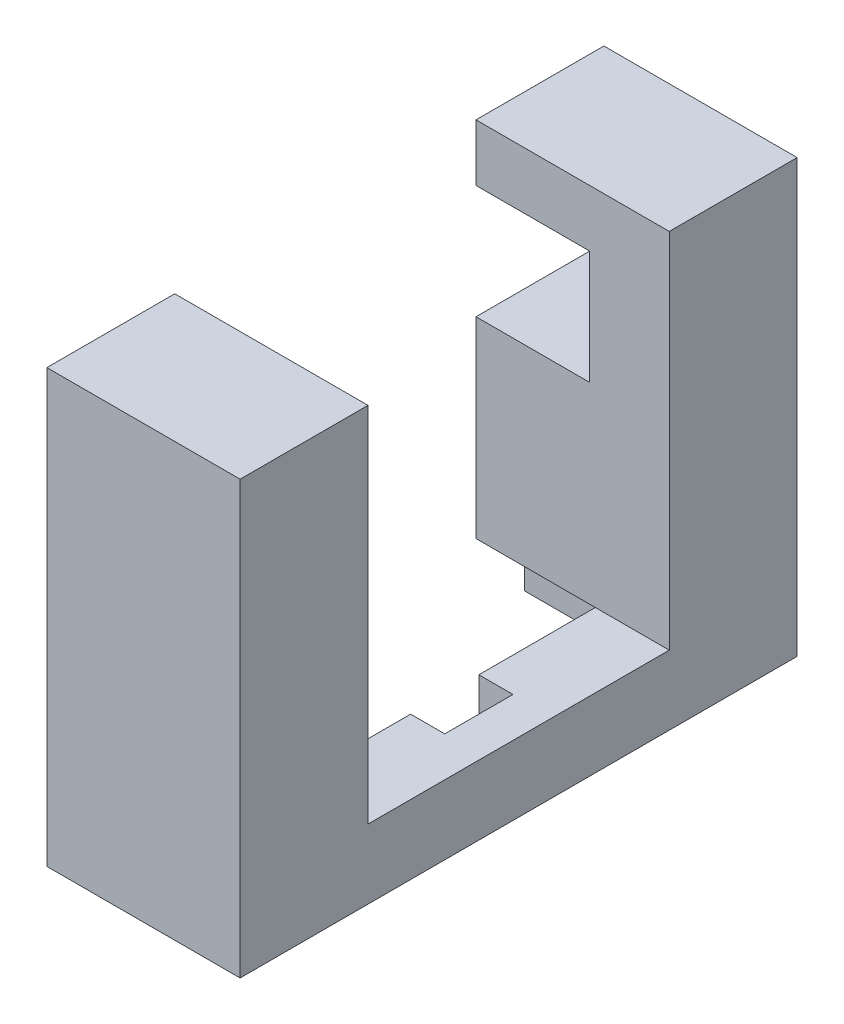
ISO-10303-21;
HEADER;
FILE_DESCRIPTION(('STEP AP214'),'2;1');
FILE_NAME('part.step','',(''),(''),'','','');
FILE_SCHEMA(('AUTOMOTIVE_DESIGN { 1 0 10303 214 1 1 1 1 }'));
ENDSEC;
DATA;
#1=APPLICATION_CONTEXT('core data for automotive mechanical design processes');
#2=APPLICATION_PROTOCOL_DEFINITION('international standard','automotive_design',2000,#1);
#3=PRODUCT_CONTEXT('',#1,'mechanical');
#4=PRODUCT('Part','Part','',(#3));
#5=PRODUCT_RELATED_PRODUCT_CATEGORY('part','',(#4));
#6=PRODUCT_DEFINITION_FORMATION('','',#4);
#7=PRODUCT_DEFINITION_CONTEXT('part definition',#1,'design');
#8=PRODUCT_DEFINITION('design','',#6,#7);
#9=PRODUCT_DEFINITION_SHAPE('','',#8);
#10=(LENGTH_UNIT() NAMED_UNIT(*) SI_UNIT(.MILLI.,.METRE.));
#11=(NAMED_UNIT(*) PLANE_ANGLE_UNIT() SI_UNIT($,.RADIAN.));
#12=(NAMED_UNIT(*) SI_UNIT($,.STERADIAN.) SOLID_ANGLE_UNIT());
#13=UNCERTAINTY_MEASURE_WITH_UNIT(LENGTH_MEASURE(1.E-05),#10,'distance_accuracy_value','');
#14=(GEOMETRIC_REPRESENTATION_CONTEXT(3) GLOBAL_UNCERTAINTY_ASSIGNED_CONTEXT((#13)) GLOBAL_UNIT_ASSIGNED_CONTEXT((#10,
#11,#12)) REPRESENTATION_CONTEXT('',''));
#15=CARTESIAN_POINT('',(0.,0.,0.));
#16=DIRECTION('',(0.,0.,1.));
#17=DIRECTION('',(1.,0.,0.));
#18=AXIS2_PLACEMENT_3D('',#15,#16,#17);
#19=CARTESIAN_POINT('',(30.5,38.001,-3.));
#20=DIRECTION('',(0.,0.,-1.));
#21=DIRECTION('',(-1.,0.,0.));
#22=AXIS2_PLACEMENT_3D('',#19,#20,#21);
#23=PLANE('',#22);
#24=DIRECTION('',(0.,-1.,0.));
#25=VECTOR('',#24,1.);
#26=CARTESIAN_POINT('',(27.5,38.001,-3.));
#27=LINE('',#26,#25);
#28=CARTESIAN_POINT('',(27.5,6.09999999999999,-3.));
#29=VERTEX_POINT('',#28);
#30=CARTESIAN_POINT('',(27.5,0.,-3.));
#31=VERTEX_POINT('',#30);
#32=EDGE_CURVE('E707',#29,#31,#27,.T.);
#33=ORIENTED_EDGE('',*,*,#32,.T.);
#34=DIRECTION('',(1.,0.,0.));
#35=VECTOR('',#34,1.);
#36=CARTESIAN_POINT('',(30.5,0.,-3.));
#37=LINE('',#36,#35);
#38=CARTESIAN_POINT('',(30.5,0.,-3.));
#39=VERTEX_POINT('',#38);
#40=EDGE_CURVE('E219',#31,#39,#37,.T.);
#41=ORIENTED_EDGE('',*,*,#40,.T.);
#42=DIRECTION('',(0.,-1.,0.));
#43=VECTOR('',#42,1.);
#44=CARTESIAN_POINT('',(30.5,38.001,-3.));
#45=LINE('',#44,#43);
#46=CARTESIAN_POINT('',(30.5,6.1,-3.));
#47=VERTEX_POINT('',#46);
#48=EDGE_CURVE('E711',#47,#39,#45,.T.);
#49=ORIENTED_EDGE('',*,*,#48,.F.);
#50=DIRECTION('',(1.,0.,0.));
#51=VECTOR('',#50,1.);
#52=CARTESIAN_POINT('',(30.5,6.1,-3.));
#53=LINE('',#52,#51);
#54=EDGE_CURVE('E209',#29,#47,#53,.T.);
#55=ORIENTED_EDGE('',*,*,#54,.F.);
#56=EDGE_LOOP('',(#33,#41,#49,#55));
#57=FACE_BOUND('',#56,.T.);
#58=ADVANCED_FACE('F32',(#57),#23,.F.);
#59=CARTESIAN_POINT('',(30.5,38.001,-3.));
#60=DIRECTION('',(1.,0.,0.));
#61=DIRECTION('',(0.,0.,-1.));
#62=AXIS2_PLACEMENT_3D('',#59,#60,#61);
#63=PLANE('',#62);
#64=ORIENTED_EDGE('',*,*,#48,.T.);
#65=DIRECTION('',(0.,0.,1.));
#66=VECTOR('',#65,1.);
#67=CARTESIAN_POINT('',(30.5,0.,-3.));
#68=LINE('',#67,#66);
#69=CARTESIAN_POINT('',(30.5,0.,3.));
#70=VERTEX_POINT('',#69);
#71=EDGE_CURVE('E714',#39,#70,#68,.T.);
#72=ORIENTED_EDGE('',*,*,#71,.T.);
#73=DIRECTION('',(0.,-1.,0.));
#74=VECTOR('',#73,1.);
#75=CARTESIAN_POINT('',(30.5,38.001,3.));
#76=LINE('',#75,#74);
#77=CARTESIAN_POINT('',(30.5,6.1,3.));
#78=VERTEX_POINT('',#77);
#79=EDGE_CURVE('E210',#78,#70,#76,.T.);
#80=ORIENTED_EDGE('',*,*,#79,.F.);
#81=DIRECTION('',(0.,0.,1.));
#82=VECTOR('',#81,1.);
#83=CARTESIAN_POINT('',(30.5,6.1,-3.));
#84=LINE('',#83,#82);
#85=EDGE_CURVE('E218',#47,#78,#84,.T.);
#86=ORIENTED_EDGE('',*,*,#85,.F.);
#87=EDGE_LOOP('',(#64,#72,#80,#86));
#88=FACE_BOUND('',#87,.T.);
#89=ADVANCED_FACE('F419',(#88),#63,.F.);
#90=CARTESIAN_POINT('',(30.5,38.001,3.));
#91=DIRECTION('',(0.,0.,1.));
#92=DIRECTION('',(1.,0.,0.));
#93=AXIS2_PLACEMENT_3D('',#90,#91,#92);
#94=PLANE('',#93);
#95=ORIENTED_EDGE('',*,*,#79,.T.);
#96=DIRECTION('',(-1.,0.,0.));
#97=VECTOR('',#96,1.);
#98=CARTESIAN_POINT('',(30.5,0.,3.));
#99=LINE('',#98,#97);
#100=CARTESIAN_POINT('',(27.5,0.,3.));
#101=VERTEX_POINT('',#100);
#102=EDGE_CURVE('E205',#70,#101,#99,.T.);
#103=ORIENTED_EDGE('',*,*,#102,.T.);
#104=DIRECTION('',(0.,-1.,0.));
#105=VECTOR('',#104,1.);
#106=CARTESIAN_POINT('',(27.5,38.001,3.));
#107=LINE('',#106,#105);
#108=CARTESIAN_POINT('',(27.5,6.09999999999999,3.));
#109=VERTEX_POINT('',#108);
#110=EDGE_CURVE('E199',#109,#101,#107,.T.);
#111=ORIENTED_EDGE('',*,*,#110,.F.);
#112=DIRECTION('',(-1.,0.,0.));
#113=VECTOR('',#112,1.);
#114=CARTESIAN_POINT('',(30.5,6.1,3.));
#115=LINE('',#114,#113);
#116=EDGE_CURVE('E202',#78,#109,#115,.T.);
#117=ORIENTED_EDGE('',*,*,#116,.F.);
#118=EDGE_LOOP('',(#95,#103,#111,#117));
#119=FACE_BOUND('',#118,.T.);
#120=ADVANCED_FACE('F201',(#119),#94,.F.);
#121=CARTESIAN_POINT('',(34.,6.1,24.5));
#122=DIRECTION('',(0.,0.,-1.));
#123=DIRECTION('',(-1.,0.,0.));
#124=AXIS2_PLACEMENT_3D('',#121,#122,#123);
#125=PLANE('',#124);
#126=DIRECTION('',(0.,-1.,0.));
#127=VECTOR('',#126,1.);
#128=CARTESIAN_POINT('',(17.,38.,24.5));
#129=LINE('',#128,#127);
#130=CARTESIAN_POINT('',(17.,38.,24.5));
#131=VERTEX_POINT('',#130);
#132=CARTESIAN_POINT('',(17.,0.,24.5));
#133=VERTEX_POINT('',#132);
#134=EDGE_CURVE('E48',#131,#133,#129,.T.);
#135=ORIENTED_EDGE('',*,*,#134,.T.);
#136=DIRECTION('',(1.,0.,0.));
#137=VECTOR('',#136,1.);
#138=CARTESIAN_POINT('',(34.,0.,24.5));
#139=LINE('',#138,#137);
#140=CARTESIAN_POINT('',(34.,0.,24.5));
#141=VERTEX_POINT('',#140);
#142=EDGE_CURVE('E361',#133,#141,#139,.T.);
#143=ORIENTED_EDGE('',*,*,#142,.T.);
#144=DIRECTION('',(0.,-1.,0.));
#145=VECTOR('',#144,1.);
#146=CARTESIAN_POINT('',(34.,6.1,24.5));
#147=LINE('',#146,#145);
#148=CARTESIAN_POINT('',(34.,38.,24.5));
#149=VERTEX_POINT('',#148);
#150=EDGE_CURVE('E374',#149,#141,#147,.T.);
#151=ORIENTED_EDGE('',*,*,#150,.F.);
#152=DIRECTION('',(-1.,0.,0.));
#153=VECTOR('',#152,1.);
#154=CARTESIAN_POINT('',(34.,38.,24.5));
#155=LINE('',#154,#153);
#156=EDGE_CURVE('E340',#149,#131,#155,.T.);
#157=ORIENTED_EDGE('',*,*,#156,.T.);
#158=EDGE_LOOP('',(#135,#143,#151,#157));
#159=FACE_BOUND('',#158,.T.);
#160=ADVANCED_FACE('F34',(#159),#125,.F.);
#161=CARTESIAN_POINT('',(0.,6.1,0.));
#162=DIRECTION('',(0.,1.,0.));
#163=DIRECTION('',(0.,0.,1.));
#164=AXIS2_PLACEMENT_3D('',#161,#162,#163);
#165=PLANE('',#164);
#166=ORIENTED_EDGE('',*,*,#116,.T.);
#167=DIRECTION('',(0.,0.,1.));
#168=VECTOR('',#167,1.);
#169=CARTESIAN_POINT('',(27.5,6.09999999999999,-17.5));
#170=LINE('',#169,#168);
#171=CARTESIAN_POINT('',(27.5,6.09999999999999,13.25));
#172=VERTEX_POINT('',#171);
#173=EDGE_CURVE('E215',#109,#172,#170,.T.);
#174=ORIENTED_EDGE('',*,*,#173,.T.);
#175=DIRECTION('',(-1.,0.,0.));
#176=VECTOR('',#175,1.);
#177=CARTESIAN_POINT('',(0.,6.1,13.25));
#178=LINE('',#177,#176);
#179=CARTESIAN_POINT('',(34.,6.1,13.25));
#180=VERTEX_POINT('',#179);
#181=EDGE_CURVE('E359',#180,#172,#178,.T.);
#182=ORIENTED_EDGE('',*,*,#181,.F.);
#183=DIRECTION('',(0.,0.,-1.));
#184=VECTOR('',#183,1.);
#185=CARTESIAN_POINT('',(34.,6.1,24.5));
#186=LINE('',#185,#184);
#187=CARTESIAN_POINT('',(34.,6.1,-13.25));
#188=VERTEX_POINT('',#187);
#189=EDGE_CURVE('E362',#180,#188,#186,.T.);
#190=ORIENTED_EDGE('',*,*,#189,.T.);
#191=DIRECTION('',(1.,0.,0.));
#192=VECTOR('',#191,1.);
#193=CARTESIAN_POINT('',(0.,6.1,-13.25));
#194=LINE('',#193,#192);
#195=CARTESIAN_POINT('',(27.5,6.1,-13.25));
#196=VERTEX_POINT('',#195);
#197=EDGE_CURVE('E327',#196,#188,#194,.T.);
#198=ORIENTED_EDGE('',*,*,#197,.F.);
#199=EDGE_CURVE('E226',#196,#29,#170,.T.);
#200=ORIENTED_EDGE('',*,*,#199,.T.);
#201=ORIENTED_EDGE('',*,*,#54,.T.);
#202=ORIENTED_EDGE('',*,*,#85,.T.);
#203=EDGE_LOOP('',(#166,#174,#182,#190,#198,#200,#201,#202));
#204=FACE_BOUND('',#203,.T.);
#205=ADVANCED_FACE('F214',(#204),#165,.T.);
#206=CARTESIAN_POINT('',(-34.001,23.,23.25));
#207=DIRECTION('',(0.,-1.,0.));
#208=DIRECTION('',(0.,0.,-1.));
#209=AXIS2_PLACEMENT_3D('',#206,#207,#208);
#210=PLANE('',#209);
#211=DIRECTION('',(-1.,0.,0.));
#212=VECTOR('',#211,1.);
#213=CARTESIAN_POINT('',(-34.001,23.,-13.25));
#214=LINE('',#213,#212);
#215=CARTESIAN_POINT('',(27.,23.,-13.25));
#216=VERTEX_POINT('',#215);
#217=CARTESIAN_POINT('',(17.,23.,-13.25));
#218=VERTEX_POINT('',#217);
#219=EDGE_CURVE('E258',#216,#218,#214,.T.);
#220=ORIENTED_EDGE('',*,*,#219,.F.);
#221=DIRECTION('',(0.,0.,-1.));
#222=VECTOR('',#221,1.);
#223=CARTESIAN_POINT('',(27.,23.,23.25));
#224=LINE('',#223,#222);
#225=CARTESIAN_POINT('',(27.,23.,-23.25));
#226=VERTEX_POINT('',#225);
#227=EDGE_CURVE('E262',#216,#226,#224,.T.);
#228=ORIENTED_EDGE('',*,*,#227,.T.);
#229=DIRECTION('',(1.,0.,0.));
#230=VECTOR('',#229,1.);
#231=CARTESIAN_POINT('',(-34.001,23.,-23.25));
#232=LINE('',#231,#230);
#233=CARTESIAN_POINT('',(17.,23.,-23.25));
#234=VERTEX_POINT('',#233);
#235=EDGE_CURVE('E257',#234,#226,#232,.T.);
#236=ORIENTED_EDGE('',*,*,#235,.F.);
#237=DIRECTION('',(0.,0.,-1.));
#238=VECTOR('',#237,1.);
#239=CARTESIAN_POINT('',(17.,23.,23.25));
#240=LINE('',#239,#238);
#241=EDGE_CURVE('E254',#218,#234,#240,.T.);
#242=ORIENTED_EDGE('',*,*,#241,.F.);
#243=EDGE_LOOP('',(#220,#228,#236,#242));
#244=FACE_BOUND('',#243,.T.);
#245=ADVANCED_FACE('F417',(#244),#210,.F.);
#246=CARTESIAN_POINT('',(34.,38.,13.25));
#247=DIRECTION('',(0.,0.,-1.));
#248=DIRECTION('',(-1.,0.,0.));
#249=AXIS2_PLACEMENT_3D('',#246,#247,#248);
#250=PLANE('',#249);
#251=DIRECTION('',(1.,0.,0.));
#252=VECTOR('',#251,1.);
#253=CARTESIAN_POINT('',(-34.001,23.,13.25));
#254=LINE('',#253,#252);
#255=CARTESIAN_POINT('',(17.,23.,13.25));
#256=VERTEX_POINT('',#255);
#257=CARTESIAN_POINT('',(27.,23.,13.25));
#258=VERTEX_POINT('',#257);
#259=EDGE_CURVE('E287',#256,#258,#254,.T.);
#260=ORIENTED_EDGE('',*,*,#259,.T.);
#261=DIRECTION('',(0.,1.,0.));
#262=VECTOR('',#261,1.);
#263=CARTESIAN_POINT('',(27.,0.,13.25));
#264=LINE('',#263,#262);
#265=CARTESIAN_POINT('',(27.,33.,13.25));
#266=VERTEX_POINT('',#265);
#267=EDGE_CURVE('E289',#258,#266,#264,.T.);
#268=ORIENTED_EDGE('',*,*,#267,.T.);
#269=DIRECTION('',(-1.,0.,0.));
#270=VECTOR('',#269,1.);
#271=CARTESIAN_POINT('',(-34.001,33.,13.25));
#272=LINE('',#271,#270);
#273=CARTESIAN_POINT('',(17.,33.,13.25));
#274=VERTEX_POINT('',#273);
#275=EDGE_CURVE('E306',#266,#274,#272,.T.);
#276=ORIENTED_EDGE('',*,*,#275,.T.);
#277=DIRECTION('',(0.,-1.,0.));
#278=VECTOR('',#277,1.);
#279=CARTESIAN_POINT('',(17.,38.,13.25));
#280=LINE('',#279,#278);
#281=CARTESIAN_POINT('',(17.,38.,13.25));
#282=VERTEX_POINT('',#281);
#283=EDGE_CURVE('E352',#282,#274,#280,.T.);
#284=ORIENTED_EDGE('',*,*,#283,.F.);
#285=DIRECTION('',(1.,0.,0.));
#286=VECTOR('',#285,1.);
#287=CARTESIAN_POINT('',(34.,38.,13.25));
#288=LINE('',#287,#286);
#289=CARTESIAN_POINT('',(34.,38.,13.25));
#290=VERTEX_POINT('',#289);
#291=EDGE_CURVE('E345',#282,#290,#288,.T.);
#292=ORIENTED_EDGE('',*,*,#291,.T.);
#293=DIRECTION('',(0.,-1.,0.));
#294=VECTOR('',#293,1.);
#295=CARTESIAN_POINT('',(34.,38.,13.25));
#296=LINE('',#295,#294);
#297=EDGE_CURVE('E348',#290,#180,#296,.T.);
#298=ORIENTED_EDGE('',*,*,#297,.T.);
#299=ORIENTED_EDGE('',*,*,#181,.T.);
#300=DIRECTION('',(1.,0.,0.));
#301=VECTOR('',#300,1.);
#302=CARTESIAN_POINT('',(34.,6.1,13.25));
#303=LINE('',#302,#301);
#304=CARTESIAN_POINT('',(17.,6.1,13.25));
#305=VERTEX_POINT('',#304);
#306=EDGE_CURVE('E251',#305,#172,#303,.T.);
#307=ORIENTED_EDGE('',*,*,#306,.F.);
#308=EDGE_CURVE('E355',#256,#305,#280,.T.);
#309=ORIENTED_EDGE('',*,*,#308,.F.);
#310=EDGE_LOOP('',(#260,#268,#276,#284,#292,#298,#299,#307,#309));
#311=FACE_BOUND('',#310,.T.);
#312=ADVANCED_FACE('F405',(#311),#250,.T.);
#313=CARTESIAN_POINT('',(34.,38.,-13.25));
#314=DIRECTION('',(0.,0.,1.));
#315=DIRECTION('',(1.,0.,0.));
#316=AXIS2_PLACEMENT_3D('',#313,#314,#315);
#317=PLANE('',#316);
#318=ORIENTED_EDGE('',*,*,#219,.T.);
#319=DIRECTION('',(0.,-1.,0.));
#320=VECTOR('',#319,1.);
#321=CARTESIAN_POINT('',(17.,38.,-13.25));
#322=LINE('',#321,#320);
#323=CARTESIAN_POINT('',(17.,6.1,-13.25));
#324=VERTEX_POINT('',#323);
#325=EDGE_CURVE('E331',#218,#324,#322,.T.);
#326=ORIENTED_EDGE('',*,*,#325,.T.);
#327=EDGE_CURVE('E334',#324,#196,#194,.T.);
#328=ORIENTED_EDGE('',*,*,#327,.T.);
#329=ORIENTED_EDGE('',*,*,#197,.T.);
#330=DIRECTION('',(0.,-1.,0.));
#331=VECTOR('',#330,1.);
#332=CARTESIAN_POINT('',(34.,38.,-13.25));
#333=LINE('',#332,#331);
#334=CARTESIAN_POINT('',(34.,38.,-13.25));
#335=VERTEX_POINT('',#334);
#336=EDGE_CURVE('E325',#335,#188,#333,.T.);
#337=ORIENTED_EDGE('',*,*,#336,.F.);
#338=DIRECTION('',(-1.,0.,0.));
#339=VECTOR('',#338,1.);
#340=CARTESIAN_POINT('',(34.,38.,-13.25));
#341=LINE('',#340,#339);
#342=CARTESIAN_POINT('',(17.,38.,-13.25));
#343=VERTEX_POINT('',#342);
#344=EDGE_CURVE('E317',#335,#343,#341,.T.);
#345=ORIENTED_EDGE('',*,*,#344,.T.);
#346=CARTESIAN_POINT('',(17.,33.,-13.25));
#347=VERTEX_POINT('',#346);
#348=EDGE_CURVE('E328',#343,#347,#322,.T.);
#349=ORIENTED_EDGE('',*,*,#348,.T.);
#350=DIRECTION('',(1.,0.,0.));
#351=VECTOR('',#350,1.);
#352=CARTESIAN_POINT('',(-34.001,33.,-13.25));
#353=LINE('',#352,#351);
#354=CARTESIAN_POINT('',(27.,33.,-13.25));
#355=VERTEX_POINT('',#354);
#356=EDGE_CURVE('E269',#347,#355,#353,.T.);
#357=ORIENTED_EDGE('',*,*,#356,.T.);
#358=DIRECTION('',(0.,-1.,0.));
#359=VECTOR('',#358,1.);
#360=CARTESIAN_POINT('',(27.,0.,-13.25));
#361=LINE('',#360,#359);
#362=EDGE_CURVE('E259',#355,#216,#361,.T.);
#363=ORIENTED_EDGE('',*,*,#362,.T.);
#364=EDGE_LOOP('',(#318,#326,#328,#329,#337,#345,#349,#357,#363));
#365=FACE_BOUND('',#364,.T.);
#366=ADVANCED_FACE('F400',(#365),#317,.T.);
#367=CARTESIAN_POINT('',(27.5,71.2920240520265,-17.5));
#368=DIRECTION('',(1.,0.,0.));
#369=DIRECTION('',(0.,0.,-1.));
#370=AXIS2_PLACEMENT_3D('',#367,#368,#369);
#371=PLANE('',#370);
#372=DIRECTION('',(0.,0.,1.));
#373=VECTOR('',#372,1.);
#374=CARTESIAN_POINT('',(27.5,0.,-17.5));
#375=LINE('',#374,#373);
#376=CARTESIAN_POINT('',(27.5,0.,-17.5));
#377=VERTEX_POINT('',#376);
#378=EDGE_CURVE('E497',#377,#31,#375,.T.);
#379=ORIENTED_EDGE('',*,*,#378,.T.);
#380=ORIENTED_EDGE('',*,*,#32,.F.);
#381=ORIENTED_EDGE('',*,*,#199,.F.);
#382=CARTESIAN_POINT('',(27.5,6.09999999999999,-17.5));
#383=VERTEX_POINT('',#382);
#384=EDGE_CURVE('E228',#383,#196,#170,.T.);
#385=ORIENTED_EDGE('',*,*,#384,.F.);
#386=DIRECTION('',(0.,-1.,0.));
#387=VECTOR('',#386,1.);
#388=CARTESIAN_POINT('',(27.5,71.2920240520265,-17.5));
#389=LINE('',#388,#387);
#390=EDGE_CURVE('E230',#383,#377,#389,.T.);
#391=ORIENTED_EDGE('',*,*,#390,.T.);
#392=EDGE_LOOP('',(#379,#380,#381,#385,#391));
#393=FACE_BOUND('',#392,.T.);
#394=ADVANCED_FACE('F451',(#393),#371,.F.);
#395=ORIENTED_EDGE('',*,*,#173,.F.);
#396=ORIENTED_EDGE('',*,*,#110,.T.);
#397=CARTESIAN_POINT('',(27.5,0.,17.5));
#398=VERTEX_POINT('',#397);
#399=EDGE_CURVE('E496',#101,#398,#375,.T.);
#400=ORIENTED_EDGE('',*,*,#399,.T.);
#401=DIRECTION('',(0.,-1.,0.));
#402=VECTOR('',#401,1.);
#403=CARTESIAN_POINT('',(27.5,71.2920240520265,17.5));
#404=LINE('',#403,#402);
#405=CARTESIAN_POINT('',(27.5,6.09999999999999,17.5));
#406=VERTEX_POINT('',#405);
#407=EDGE_CURVE('E233',#406,#398,#404,.T.);
#408=ORIENTED_EDGE('',*,*,#407,.F.);
#409=EDGE_CURVE('E224',#172,#406,#170,.T.);
#410=ORIENTED_EDGE('',*,*,#409,.F.);
#411=EDGE_LOOP('',(#395,#396,#400,#408,#410));
#412=FACE_BOUND('',#411,.T.);
#413=ADVANCED_FACE('F222',(#412),#371,.F.);
#414=CARTESIAN_POINT('',(0.,6.1,0.));
#415=DIRECTION('',(0.,1.,0.));
#416=DIRECTION('',(0.,0.,1.));
#417=AXIS2_PLACEMENT_3D('',#414,#415,#416);
#418=PLANE('',#417);
#419=ORIENTED_EDGE('',*,*,#306,.T.);
#420=ORIENTED_EDGE('',*,*,#409,.T.);
#421=DIRECTION('',(-1.,0.,0.));
#422=VECTOR('',#421,1.);
#423=CARTESIAN_POINT('',(27.5,6.09999999999999,17.5));
#424=LINE('',#423,#422);
#425=CARTESIAN_POINT('',(17.,6.09999999999999,17.5));
#426=VERTEX_POINT('',#425);
#427=EDGE_CURVE('E238',#406,#426,#424,.T.);
#428=ORIENTED_EDGE('',*,*,#427,.T.);
#429=DIRECTION('',(0.,0.,1.));
#430=VECTOR('',#429,1.);
#431=CARTESIAN_POINT('',(17.,6.1,0.));
#432=LINE('',#431,#430);
#433=EDGE_CURVE('E351',#305,#426,#432,.T.);
#434=ORIENTED_EDGE('',*,*,#433,.F.);
#435=EDGE_LOOP('',(#419,#420,#428,#434));
#436=FACE_BOUND('',#435,.T.);
#437=ADVANCED_FACE('F436',(#436),#418,.F.);
#438=CARTESIAN_POINT('',(0.,0.,0.));
#439=DIRECTION('',(0.,1.,0.));
#440=DIRECTION('',(0.,0.,1.));
#441=AXIS2_PLACEMENT_3D('',#438,#439,#440);
#442=PLANE('',#441);
#443=ORIENTED_EDGE('',*,*,#142,.F.);
#444=DIRECTION('',(0.,0.,-1.));
#445=VECTOR('',#444,1.);
#446=CARTESIAN_POINT('',(17.,0.,0.));
#447=LINE('',#446,#445);
#448=CARTESIAN_POINT('',(17.,0.,17.5));
#449=VERTEX_POINT('',#448);
#450=EDGE_CURVE('E11',#133,#449,#447,.T.);
#451=ORIENTED_EDGE('',*,*,#450,.T.);
#452=DIRECTION('',(-1.,0.,0.));
#453=VECTOR('',#452,1.);
#454=CARTESIAN_POINT('',(27.5,0.,17.5));
#455=LINE('',#454,#453);
#456=EDGE_CURVE('E500',#398,#449,#455,.T.);
#457=ORIENTED_EDGE('',*,*,#456,.F.);
#458=ORIENTED_EDGE('',*,*,#399,.F.);
#459=ORIENTED_EDGE('',*,*,#102,.F.);
#460=ORIENTED_EDGE('',*,*,#71,.F.);
#461=ORIENTED_EDGE('',*,*,#40,.F.);
#462=ORIENTED_EDGE('',*,*,#378,.F.);
#463=DIRECTION('',(1.,0.,0.));
#464=VECTOR('',#463,1.);
#465=CARTESIAN_POINT('',(27.5,0.,-17.5));
#466=LINE('',#465,#464);
#467=CARTESIAN_POINT('',(17.,0.,-17.5));
#468=VERTEX_POINT('',#467);
#469=EDGE_CURVE('E388',#468,#377,#466,.T.);
#470=ORIENTED_EDGE('',*,*,#469,.F.);
#471=CARTESIAN_POINT('',(17.,0.,-24.5));
#472=VERTEX_POINT('',#471);
#473=EDGE_CURVE('E41',#468,#472,#447,.T.);
#474=ORIENTED_EDGE('',*,*,#473,.T.);
#475=DIRECTION('',(-1.,0.,0.));
#476=VECTOR('',#475,1.);
#477=CARTESIAN_POINT('',(34.,0.,-24.5));
#478=LINE('',#477,#476);
#479=CARTESIAN_POINT('',(34.,0.,-24.5));
#480=VERTEX_POINT('',#479);
#481=EDGE_CURVE('E366',#480,#472,#478,.T.);
#482=ORIENTED_EDGE('',*,*,#481,.F.);
#483=DIRECTION('',(0.,0.,-1.));
#484=VECTOR('',#483,1.);
#485=CARTESIAN_POINT('',(34.,0.,24.5));
#486=LINE('',#485,#484);
#487=EDGE_CURVE('E368',#141,#480,#486,.T.);
#488=ORIENTED_EDGE('',*,*,#487,.F.);
#489=EDGE_LOOP('',(#443,#451,#457,#458,#459,#460,#461,#462,#470,#474,#482,#488));
#490=FACE_BOUND('',#489,.T.);
#491=ADVANCED_FACE('F385',(#490),#442,.F.);
#492=CARTESIAN_POINT('',(27.5,71.2920240520265,17.5));
#493=DIRECTION('',(0.,0.,1.));
#494=DIRECTION('',(1.,0.,0.));
#495=AXIS2_PLACEMENT_3D('',#492,#493,#494);
#496=PLANE('',#495);
#497=ORIENTED_EDGE('',*,*,#456,.T.);
#498=DIRECTION('',(0.,1.,0.));
#499=VECTOR('',#498,1.);
#500=CARTESIAN_POINT('',(17.,71.2920240520265,17.5));
#501=LINE('',#500,#499);
#502=EDGE_CURVE('E377',#449,#426,#501,.T.);
#503=ORIENTED_EDGE('',*,*,#502,.T.);
#504=ORIENTED_EDGE('',*,*,#427,.F.);
#505=ORIENTED_EDGE('',*,*,#407,.T.);
#506=EDGE_LOOP('',(#497,#503,#504,#505));
#507=FACE_BOUND('',#506,.T.);
#508=ADVANCED_FACE('F435',(#507),#496,.F.);
#509=DIRECTION('',(0.,0.,-1.));
#510=VECTOR('',#509,1.);
#511=CARTESIAN_POINT('',(17.,6.1,-24.5));
#512=LINE('',#511,#510);
#513=CARTESIAN_POINT('',(17.,6.09999999999999,-17.5));
#514=VERTEX_POINT('',#513);
#515=EDGE_CURVE('E244',#324,#514,#512,.T.);
#516=ORIENTED_EDGE('',*,*,#515,.T.);
#517=DIRECTION('',(1.,0.,0.));
#518=VECTOR('',#517,1.);
#519=CARTESIAN_POINT('',(27.5,6.09999999999999,-17.5));
#520=LINE('',#519,#518);
#521=EDGE_CURVE('E248',#514,#383,#520,.T.);
#522=ORIENTED_EDGE('',*,*,#521,.T.);
#523=ORIENTED_EDGE('',*,*,#384,.T.);
#524=ORIENTED_EDGE('',*,*,#327,.F.);
#525=EDGE_LOOP('',(#516,#522,#523,#524));
#526=FACE_BOUND('',#525,.T.);
#527=ADVANCED_FACE('F505',(#526),#418,.F.);
#528=CARTESIAN_POINT('',(27.5,71.2920240520265,-17.5));
#529=DIRECTION('',(0.,0.,-1.));
#530=DIRECTION('',(-1.,0.,0.));
#531=AXIS2_PLACEMENT_3D('',#528,#529,#530);
#532=PLANE('',#531);
#533=ORIENTED_EDGE('',*,*,#521,.F.);
#534=DIRECTION('',(0.,-1.,0.));
#535=VECTOR('',#534,1.);
#536=CARTESIAN_POINT('',(17.,71.2920240520265,-17.5));
#537=LINE('',#536,#535);
#538=EDGE_CURVE('E36',#514,#468,#537,.T.);
#539=ORIENTED_EDGE('',*,*,#538,.T.);
#540=ORIENTED_EDGE('',*,*,#469,.T.);
#541=ORIENTED_EDGE('',*,*,#390,.F.);
#542=EDGE_LOOP('',(#533,#539,#540,#541));
#543=FACE_BOUND('',#542,.T.);
#544=ADVANCED_FACE('F509',(#543),#532,.F.);
#545=CARTESIAN_POINT('',(27.,0.,0.));
#546=DIRECTION('',(1.,0.,0.));
#547=DIRECTION('',(0.,0.,-1.));
#548=AXIS2_PLACEMENT_3D('',#545,#546,#547);
#549=PLANE('',#548);
#550=DIRECTION('',(0.,0.,1.));
#551=VECTOR('',#550,1.);
#552=CARTESIAN_POINT('',(27.,33.,23.25));
#553=LINE('',#552,#551);
#554=CARTESIAN_POINT('',(27.,33.,-23.25));
#555=VERTEX_POINT('',#554);
#556=EDGE_CURVE('E253',#555,#355,#553,.T.);
#557=ORIENTED_EDGE('',*,*,#556,.F.);
#558=DIRECTION('',(0.,1.,0.));
#559=VECTOR('',#558,1.);
#560=CARTESIAN_POINT('',(27.,33.,-23.25));
#561=LINE('',#560,#559);
#562=EDGE_CURVE('E263',#226,#555,#561,.T.);
#563=ORIENTED_EDGE('',*,*,#562,.F.);
#564=ORIENTED_EDGE('',*,*,#227,.F.);
#565=ORIENTED_EDGE('',*,*,#362,.F.);
#566=EDGE_LOOP('',(#557,#563,#564,#565));
#567=FACE_BOUND('',#566,.T.);
#568=ADVANCED_FACE('F467',(#567),#549,.F.);
#569=CARTESIAN_POINT('',(-34.001,33.,-23.25));
#570=DIRECTION('',(0.,0.,-1.));
#571=DIRECTION('',(-1.,0.,0.));
#572=AXIS2_PLACEMENT_3D('',#569,#570,#571);
#573=PLANE('',#572);
#574=ORIENTED_EDGE('',*,*,#235,.T.);
#575=ORIENTED_EDGE('',*,*,#562,.T.);
#576=DIRECTION('',(1.,0.,0.));
#577=VECTOR('',#576,1.);
#578=CARTESIAN_POINT('',(-34.001,33.,-23.25));
#579=LINE('',#578,#577);
#580=CARTESIAN_POINT('',(17.,33.,-23.25));
#581=VERTEX_POINT('',#580);
#582=EDGE_CURVE('E270',#581,#555,#579,.T.);
#583=ORIENTED_EDGE('',*,*,#582,.F.);
#584=DIRECTION('',(0.,1.,0.));
#585=VECTOR('',#584,1.);
#586=CARTESIAN_POINT('',(17.,33.,-23.25));
#587=LINE('',#586,#585);
#588=EDGE_CURVE('E271',#234,#581,#587,.T.);
#589=ORIENTED_EDGE('',*,*,#588,.F.);
#590=EDGE_LOOP('',(#574,#575,#583,#589));
#591=FACE_BOUND('',#590,.T.);
#592=ADVANCED_FACE('F473',(#591),#573,.F.);
#593=CARTESIAN_POINT('',(-34.001,33.,23.25));
#594=DIRECTION('',(0.,1.,0.));
#595=DIRECTION('',(0.,0.,1.));
#596=AXIS2_PLACEMENT_3D('',#593,#594,#595);
#597=PLANE('',#596);
#598=ORIENTED_EDGE('',*,*,#582,.T.);
#599=ORIENTED_EDGE('',*,*,#556,.T.);
#600=ORIENTED_EDGE('',*,*,#356,.F.);
#601=DIRECTION('',(0.,0.,1.));
#602=VECTOR('',#601,1.);
#603=CARTESIAN_POINT('',(17.,33.,23.25));
#604=LINE('',#603,#602);
#605=EDGE_CURVE('E266',#581,#347,#604,.T.);
#606=ORIENTED_EDGE('',*,*,#605,.F.);
#607=EDGE_LOOP('',(#598,#599,#600,#606));
#608=FACE_BOUND('',#607,.T.);
#609=ADVANCED_FACE('F469',(#608),#597,.F.);
#610=CARTESIAN_POINT('',(-34.001,23.,23.25));
#611=DIRECTION('',(0.,-1.,0.));
#612=DIRECTION('',(0.,0.,-1.));
#613=AXIS2_PLACEMENT_3D('',#610,#611,#612);
#614=PLANE('',#613);
#615=DIRECTION('',(0.,0.,-1.));
#616=VECTOR('',#615,1.);
#617=CARTESIAN_POINT('',(17.,23.,23.25));
#618=LINE('',#617,#616);
#619=CARTESIAN_POINT('',(17.,23.,23.25));
#620=VERTEX_POINT('',#619);
#621=EDGE_CURVE('E284',#620,#256,#618,.T.);
#622=ORIENTED_EDGE('',*,*,#621,.F.);
#623=DIRECTION('',(1.,0.,0.));
#624=VECTOR('',#623,1.);
#625=CARTESIAN_POINT('',(-34.001,23.,23.25));
#626=LINE('',#625,#624);
#627=CARTESIAN_POINT('',(27.,23.,23.25));
#628=VERTEX_POINT('',#627);
#629=EDGE_CURVE('E293',#620,#628,#626,.T.);
#630=ORIENTED_EDGE('',*,*,#629,.T.);
#631=DIRECTION('',(0.,0.,-1.));
#632=VECTOR('',#631,1.);
#633=CARTESIAN_POINT('',(27.,23.,23.25));
#634=LINE('',#633,#632);
#635=EDGE_CURVE('E276',#628,#258,#634,.T.);
#636=ORIENTED_EDGE('',*,*,#635,.T.);
#637=ORIENTED_EDGE('',*,*,#259,.F.);
#638=EDGE_LOOP('',(#622,#630,#636,#637));
#639=FACE_BOUND('',#638,.T.);
#640=ADVANCED_FACE('F472',(#639),#614,.F.);
#641=CARTESIAN_POINT('',(27.,0.,0.));
#642=DIRECTION('',(1.,0.,0.));
#643=DIRECTION('',(0.,0.,-1.));
#644=AXIS2_PLACEMENT_3D('',#641,#642,#643);
#645=PLANE('',#644);
#646=ORIENTED_EDGE('',*,*,#635,.F.);
#647=DIRECTION('',(0.,-1.,0.));
#648=VECTOR('',#647,1.);
#649=CARTESIAN_POINT('',(27.,33.,23.25));
#650=LINE('',#649,#648);
#651=CARTESIAN_POINT('',(27.,33.,23.25));
#652=VERTEX_POINT('',#651);
#653=EDGE_CURVE('E288',#652,#628,#650,.T.);
#654=ORIENTED_EDGE('',*,*,#653,.F.);
#655=DIRECTION('',(0.,0.,1.));
#656=VECTOR('',#655,1.);
#657=CARTESIAN_POINT('',(27.,33.,23.25));
#658=LINE('',#657,#656);
#659=EDGE_CURVE('E292',#266,#652,#658,.T.);
#660=ORIENTED_EDGE('',*,*,#659,.F.);
#661=ORIENTED_EDGE('',*,*,#267,.F.);
#662=EDGE_LOOP('',(#646,#654,#660,#661));
#663=FACE_BOUND('',#662,.T.);
#664=ADVANCED_FACE('F475',(#663),#645,.F.);
#665=CARTESIAN_POINT('',(-34.001,33.,23.25));
#666=DIRECTION('',(0.,1.,0.));
#667=DIRECTION('',(0.,0.,1.));
#668=AXIS2_PLACEMENT_3D('',#665,#666,#667);
#669=PLANE('',#668);
#670=ORIENTED_EDGE('',*,*,#659,.T.);
#671=DIRECTION('',(1.,0.,0.));
#672=VECTOR('',#671,1.);
#673=CARTESIAN_POINT('',(-34.001,33.,23.25));
#674=LINE('',#673,#672);
#675=CARTESIAN_POINT('',(17.,33.,23.25));
#676=VERTEX_POINT('',#675);
#677=EDGE_CURVE('E297',#676,#652,#674,.T.);
#678=ORIENTED_EDGE('',*,*,#677,.F.);
#679=DIRECTION('',(0.,0.,1.));
#680=VECTOR('',#679,1.);
#681=CARTESIAN_POINT('',(17.,33.,23.25));
#682=LINE('',#681,#680);
#683=EDGE_CURVE('E299',#274,#676,#682,.T.);
#684=ORIENTED_EDGE('',*,*,#683,.F.);
#685=ORIENTED_EDGE('',*,*,#275,.F.);
#686=EDGE_LOOP('',(#670,#678,#684,#685));
#687=FACE_BOUND('',#686,.T.);
#688=ADVANCED_FACE('F478',(#687),#669,.F.);
#689=CARTESIAN_POINT('',(-34.001,33.,23.25));
#690=DIRECTION('',(0.,0.,1.));
#691=DIRECTION('',(1.,0.,0.));
#692=AXIS2_PLACEMENT_3D('',#689,#690,#691);
#693=PLANE('',#692);
#694=ORIENTED_EDGE('',*,*,#677,.T.);
#695=ORIENTED_EDGE('',*,*,#653,.T.);
#696=ORIENTED_EDGE('',*,*,#629,.F.);
#697=DIRECTION('',(0.,-1.,0.));
#698=VECTOR('',#697,1.);
#699=CARTESIAN_POINT('',(17.,33.,23.25));
#700=LINE('',#699,#698);
#701=EDGE_CURVE('E296',#676,#620,#700,.T.);
#702=ORIENTED_EDGE('',*,*,#701,.F.);
#703=EDGE_LOOP('',(#694,#695,#696,#702));
#704=FACE_BOUND('',#703,.T.);
#705=ADVANCED_FACE('F438',(#704),#693,.F.);
#706=CARTESIAN_POINT('',(34.,6.1,-24.5));
#707=DIRECTION('',(0.,0.,1.));
#708=DIRECTION('',(1.,0.,0.));
#709=AXIS2_PLACEMENT_3D('',#706,#707,#708);
#710=PLANE('',#709);
#711=ORIENTED_EDGE('',*,*,#481,.T.);
#712=DIRECTION('',(0.,-1.,0.));
#713=VECTOR('',#712,1.);
#714=CARTESIAN_POINT('',(17.,38.,-24.5));
#715=LINE('',#714,#713);
#716=CARTESIAN_POINT('',(17.,38.,-24.5));
#717=VERTEX_POINT('',#716);
#718=EDGE_CURVE('E56',#717,#472,#715,.T.);
#719=ORIENTED_EDGE('',*,*,#718,.F.);
#720=DIRECTION('',(1.,0.,0.));
#721=VECTOR('',#720,1.);
#722=CARTESIAN_POINT('',(34.,38.,-24.5));
#723=LINE('',#722,#721);
#724=CARTESIAN_POINT('',(34.,38.,-24.5));
#725=VERTEX_POINT('',#724);
#726=EDGE_CURVE('E322',#717,#725,#723,.T.);
#727=ORIENTED_EDGE('',*,*,#726,.T.);
#728=DIRECTION('',(0.,-1.,0.));
#729=VECTOR('',#728,1.);
#730=CARTESIAN_POINT('',(34.,6.1,-24.5));
#731=LINE('',#730,#729);
#732=EDGE_CURVE('E365',#725,#480,#731,.T.);
#733=ORIENTED_EDGE('',*,*,#732,.T.);
#734=EDGE_LOOP('',(#711,#719,#727,#733));
#735=FACE_BOUND('',#734,.T.);
#736=ADVANCED_FACE('F390',(#735),#710,.F.);
#737=CARTESIAN_POINT('',(34.,6.1,24.5));
#738=DIRECTION('',(-1.,0.,0.));
#739=DIRECTION('',(0.,0.,1.));
#740=AXIS2_PLACEMENT_3D('',#737,#738,#739);
#741=PLANE('',#740);
#742=ORIENTED_EDGE('',*,*,#487,.T.);
#743=ORIENTED_EDGE('',*,*,#732,.F.);
#744=DIRECTION('',(0.,0.,1.));
#745=VECTOR('',#744,1.);
#746=CARTESIAN_POINT('',(34.,38.,-24.5));
#747=LINE('',#746,#745);
#748=EDGE_CURVE('E295',#725,#335,#747,.T.);
#749=ORIENTED_EDGE('',*,*,#748,.T.);
#750=ORIENTED_EDGE('',*,*,#336,.T.);
#751=ORIENTED_EDGE('',*,*,#189,.F.);
#752=ORIENTED_EDGE('',*,*,#297,.F.);
#753=DIRECTION('',(0.,0.,1.));
#754=VECTOR('',#753,1.);
#755=CARTESIAN_POINT('',(34.,38.,24.5));
#756=LINE('',#755,#754);
#757=EDGE_CURVE('E337',#290,#149,#756,.T.);
#758=ORIENTED_EDGE('',*,*,#757,.T.);
#759=ORIENTED_EDGE('',*,*,#150,.T.);
#760=EDGE_LOOP('',(#742,#743,#749,#750,#751,#752,#758,#759));
#761=FACE_BOUND('',#760,.T.);
#762=ADVANCED_FACE('F394',(#761),#741,.F.);
#763=CARTESIAN_POINT('',(0.,38.,0.));
#764=DIRECTION('',(0.,-1.,0.));
#765=DIRECTION('',(0.,0.,-1.));
#766=AXIS2_PLACEMENT_3D('',#763,#764,#765);
#767=PLANE('',#766);
#768=ORIENTED_EDGE('',*,*,#748,.F.);
#769=ORIENTED_EDGE('',*,*,#726,.F.);
#770=DIRECTION('',(0.,0.,-1.));
#771=VECTOR('',#770,1.);
#772=CARTESIAN_POINT('',(17.,38.,-24.5));
#773=LINE('',#772,#771);
#774=EDGE_CURVE('E320',#343,#717,#773,.T.);
#775=ORIENTED_EDGE('',*,*,#774,.F.);
#776=ORIENTED_EDGE('',*,*,#344,.F.);
#777=EDGE_LOOP('',(#768,#769,#775,#776));
#778=FACE_BOUND('',#777,.T.);
#779=ADVANCED_FACE('F397',(#778),#767,.F.);
#780=CARTESIAN_POINT('',(0.,38.,0.));
#781=DIRECTION('',(0.,1.,0.));
#782=DIRECTION('',(0.,0.,1.));
#783=AXIS2_PLACEMENT_3D('',#780,#781,#782);
#784=PLANE('',#783);
#785=ORIENTED_EDGE('',*,*,#757,.F.);
#786=ORIENTED_EDGE('',*,*,#291,.F.);
#787=DIRECTION('',(0.,0.,-1.));
#788=VECTOR('',#787,1.);
#789=CARTESIAN_POINT('',(17.,38.,24.5));
#790=LINE('',#789,#788);
#791=EDGE_CURVE('E342',#131,#282,#790,.T.);
#792=ORIENTED_EDGE('',*,*,#791,.F.);
#793=ORIENTED_EDGE('',*,*,#156,.F.);
#794=EDGE_LOOP('',(#785,#786,#792,#793));
#795=FACE_BOUND('',#794,.T.);
#796=ADVANCED_FACE('F410',(#795),#784,.T.);
#797=CARTESIAN_POINT('',(17.,38.,-24.5));
#798=DIRECTION('',(-1.,0.,0.));
#799=DIRECTION('',(0.,0.,1.));
#800=AXIS2_PLACEMENT_3D('',#797,#798,#799);
#801=PLANE('',#800);
#802=ORIENTED_EDGE('',*,*,#241,.T.);
#803=ORIENTED_EDGE('',*,*,#588,.T.);
#804=ORIENTED_EDGE('',*,*,#605,.T.);
#805=ORIENTED_EDGE('',*,*,#348,.F.);
#806=ORIENTED_EDGE('',*,*,#774,.T.);
#807=ORIENTED_EDGE('',*,*,#718,.T.);
#808=ORIENTED_EDGE('',*,*,#473,.F.);
#809=ORIENTED_EDGE('',*,*,#538,.F.);
#810=ORIENTED_EDGE('',*,*,#515,.F.);
#811=ORIENTED_EDGE('',*,*,#325,.F.);
#812=EDGE_LOOP('',(#802,#803,#804,#805,#806,#807,#808,#809,#810,#811));
#813=FACE_BOUND('',#812,.T.);
#814=ADVANCED_FACE('F423',(#813),#801,.T.);
#815=CARTESIAN_POINT('',(17.,38.,24.5));
#816=DIRECTION('',(-1.,0.,0.));
#817=DIRECTION('',(0.,0.,1.));
#818=AXIS2_PLACEMENT_3D('',#815,#816,#817);
#819=PLANE('',#818);
#820=ORIENTED_EDGE('',*,*,#621,.T.);
#821=ORIENTED_EDGE('',*,*,#308,.T.);
#822=ORIENTED_EDGE('',*,*,#433,.T.);
#823=ORIENTED_EDGE('',*,*,#502,.F.);
#824=ORIENTED_EDGE('',*,*,#450,.F.);
#825=ORIENTED_EDGE('',*,*,#134,.F.);
#826=ORIENTED_EDGE('',*,*,#791,.T.);
#827=ORIENTED_EDGE('',*,*,#283,.T.);
#828=ORIENTED_EDGE('',*,*,#683,.T.);
#829=ORIENTED_EDGE('',*,*,#701,.T.);
#830=EDGE_LOOP('',(#820,#821,#822,#823,#824,#825,#826,#827,#828,#829));
#831=FACE_BOUND('',#830,.T.);
#832=ADVANCED_FACE('F421',(#831),#819,.T.);
#833=CLOSED_SHELL('',(#58,#89,#120,#160,#205,#245,#312,#366,#394,#413,#437,#491,#508,#527,#544,
#568,#592,#609,#640,#664,#688,#705,#736,#762,#779,#796,#814,#832));
#834=MANIFOLD_SOLID_BREP('B2',#833);
#835=ADVANCED_BREP_SHAPE_REPRESENTATION('',(#18,#834),#14);
#836=SHAPE_DEFINITION_REPRESENTATION(#9,#835);
ENDSEC;
END-ISO-10303-21;
